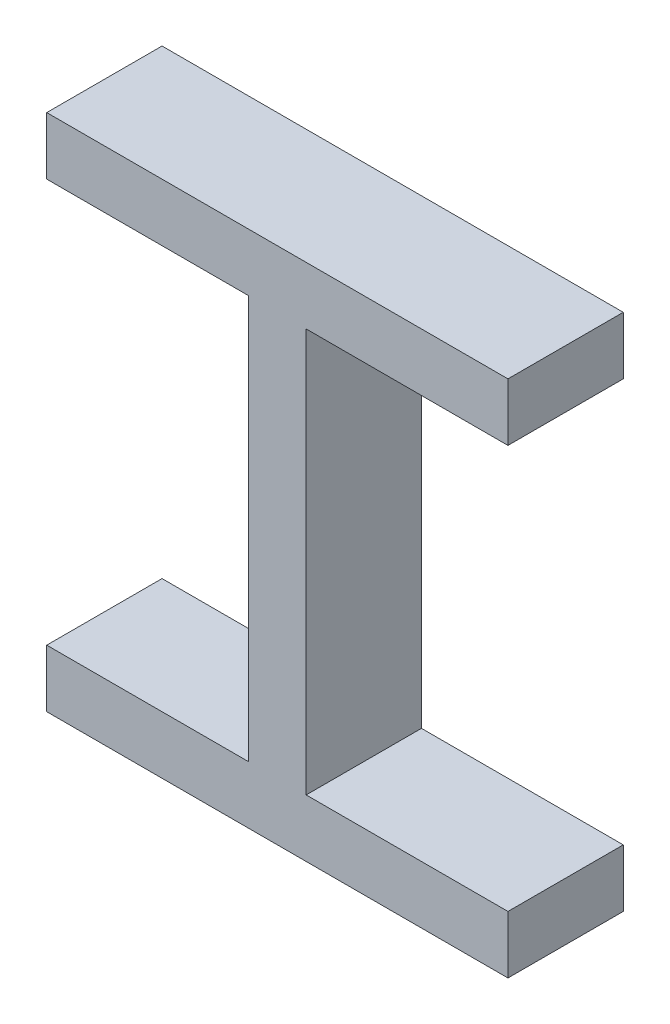
ISO-10303-21;
HEADER;
FILE_DESCRIPTION(('STEP AP214'),'2;1');
FILE_NAME('part.step','',(''),(''),'','','');
FILE_SCHEMA(('AUTOMOTIVE_DESIGN { 1 0 10303 214 1 1 1 1 }'));
ENDSEC;
DATA;
#1=APPLICATION_CONTEXT('core data for automotive mechanical design processes');
#2=APPLICATION_PROTOCOL_DEFINITION('international standard','automotive_design',2000,#1);
#3=PRODUCT_CONTEXT('',#1,'mechanical');
#4=PRODUCT('Part','Part','',(#3));
#5=PRODUCT_RELATED_PRODUCT_CATEGORY('part','',(#4));
#6=PRODUCT_DEFINITION_FORMATION('','',#4);
#7=PRODUCT_DEFINITION_CONTEXT('part definition',#1,'design');
#8=PRODUCT_DEFINITION('design','',#6,#7);
#9=PRODUCT_DEFINITION_SHAPE('','',#8);
#10=(LENGTH_UNIT() NAMED_UNIT(*) SI_UNIT(.MILLI.,.METRE.));
#11=(NAMED_UNIT(*) PLANE_ANGLE_UNIT() SI_UNIT($,.RADIAN.));
#12=(NAMED_UNIT(*) SI_UNIT($,.STERADIAN.) SOLID_ANGLE_UNIT());
#13=UNCERTAINTY_MEASURE_WITH_UNIT(LENGTH_MEASURE(1.E-05),#10,'distance_accuracy_value','');
#14=(GEOMETRIC_REPRESENTATION_CONTEXT(3) GLOBAL_UNCERTAINTY_ASSIGNED_CONTEXT((#13)) GLOBAL_UNIT_ASSIGNED_CONTEXT((#10,
#11,#12)) REPRESENTATION_CONTEXT('',''));
#15=CARTESIAN_POINT('',(0.,0.,0.));
#16=DIRECTION('',(0.,0.,1.));
#17=DIRECTION('',(1.,0.,0.));
#18=AXIS2_PLACEMENT_3D('',#15,#16,#17);
#19=CARTESIAN_POINT('',(0.,0.,40.));
#20=DIRECTION('',(1.,0.,0.));
#21=DIRECTION('',(0.,0.,-1.));
#22=AXIS2_PLACEMENT_3D('',#19,#20,#21);
#23=PLANE('',#22);
#24=DIRECTION('',(0.,-1.,0.));
#25=VECTOR('',#24,1.);
#26=CARTESIAN_POINT('',(0.,0.,0.));
#27=LINE('',#26,#25);
#28=CARTESIAN_POINT('',(0.,0.,0.));
#29=VERTEX_POINT('',#28);
#30=CARTESIAN_POINT('',(0.,-20.,0.));
#31=VERTEX_POINT('',#30);
#32=EDGE_CURVE('E169',#29,#31,#27,.T.);
#33=ORIENTED_EDGE('',*,*,#32,.T.);
#34=DIRECTION('',(0.,0.,-1.));
#35=VECTOR('',#34,1.);
#36=CARTESIAN_POINT('',(0.,-20.,40.));
#37=LINE('',#36,#35);
#38=CARTESIAN_POINT('',(0.,-20.,40.));
#39=VERTEX_POINT('',#38);
#40=EDGE_CURVE('E11',#39,#31,#37,.T.);
#41=ORIENTED_EDGE('',*,*,#40,.F.);
#42=DIRECTION('',(0.,-1.,0.));
#43=VECTOR('',#42,1.);
#44=CARTESIAN_POINT('',(0.,0.,40.));
#45=LINE('',#44,#43);
#46=CARTESIAN_POINT('',(0.,0.,40.));
#47=VERTEX_POINT('',#46);
#48=EDGE_CURVE('E203',#47,#39,#45,.T.);
#49=ORIENTED_EDGE('',*,*,#48,.F.);
#50=DIRECTION('',(0.,0.,-1.));
#51=VECTOR('',#50,1.);
#52=CARTESIAN_POINT('',(0.,0.,40.));
#53=LINE('',#52,#51);
#54=EDGE_CURVE('E165',#47,#29,#53,.T.);
#55=ORIENTED_EDGE('',*,*,#54,.T.);
#56=EDGE_LOOP('',(#33,#41,#49,#55));
#57=FACE_BOUND('',#56,.T.);
#58=ADVANCED_FACE('F44',(#57),#23,.F.);
#59=CARTESIAN_POINT('',(0.,-20.,40.));
#60=DIRECTION('',(0.,1.,0.));
#61=DIRECTION('',(0.,0.,1.));
#62=AXIS2_PLACEMENT_3D('',#59,#60,#61);
#63=PLANE('',#62);
#64=DIRECTION('',(1.,0.,0.));
#65=VECTOR('',#64,1.);
#66=CARTESIAN_POINT('',(0.,-20.,0.));
#67=LINE('',#66,#65);
#68=CARTESIAN_POINT('',(70.,-20.,0.));
#69=VERTEX_POINT('',#68);
#70=EDGE_CURVE('E173',#31,#69,#67,.T.);
#71=ORIENTED_EDGE('',*,*,#70,.T.);
#72=DIRECTION('',(0.,0.,-1.));
#73=VECTOR('',#72,1.);
#74=CARTESIAN_POINT('',(70.,-20.,40.));
#75=LINE('',#74,#73);
#76=CARTESIAN_POINT('',(70.,-20.,40.));
#77=VERTEX_POINT('',#76);
#78=EDGE_CURVE('E53',#77,#69,#75,.T.);
#79=ORIENTED_EDGE('',*,*,#78,.F.);
#80=DIRECTION('',(1.,0.,0.));
#81=VECTOR('',#80,1.);
#82=CARTESIAN_POINT('',(0.,-20.,40.));
#83=LINE('',#82,#81);
#84=EDGE_CURVE('E116',#39,#77,#83,.T.);
#85=ORIENTED_EDGE('',*,*,#84,.F.);
#86=ORIENTED_EDGE('',*,*,#40,.T.);
#87=EDGE_LOOP('',(#71,#79,#85,#86));
#88=FACE_BOUND('',#87,.T.);
#89=ADVANCED_FACE('F297',(#88),#63,.F.);
#90=CARTESIAN_POINT('',(70.,-20.,40.));
#91=DIRECTION('',(1.,0.,0.));
#92=DIRECTION('',(0.,1.,0.));
#93=AXIS2_PLACEMENT_3D('',#90,#91,#92);
#94=PLANE('',#93);
#95=DIRECTION('',(0.,-1.,0.));
#96=VECTOR('',#95,1.);
#97=CARTESIAN_POINT('',(70.,-20.,0.));
#98=LINE('',#97,#96);
#99=CARTESIAN_POINT('',(70.,-160.,0.));
#100=VERTEX_POINT('',#99);
#101=EDGE_CURVE('E176',#69,#100,#98,.T.);
#102=ORIENTED_EDGE('',*,*,#101,.T.);
#103=DIRECTION('',(0.,0.,-1.));
#104=VECTOR('',#103,1.);
#105=CARTESIAN_POINT('',(70.,-160.,40.));
#106=LINE('',#105,#104);
#107=CARTESIAN_POINT('',(70.,-160.,40.));
#108=VERTEX_POINT('',#107);
#109=EDGE_CURVE('E230',#108,#100,#106,.T.);
#110=ORIENTED_EDGE('',*,*,#109,.F.);
#111=DIRECTION('',(0.,-1.,0.));
#112=VECTOR('',#111,1.);
#113=CARTESIAN_POINT('',(70.,-20.,40.));
#114=LINE('',#113,#112);
#115=EDGE_CURVE('E240',#77,#108,#114,.T.);
#116=ORIENTED_EDGE('',*,*,#115,.F.);
#117=ORIENTED_EDGE('',*,*,#78,.T.);
#118=EDGE_LOOP('',(#102,#110,#116,#117));
#119=FACE_BOUND('',#118,.T.);
#120=ADVANCED_FACE('F238',(#119),#94,.F.);
#121=CARTESIAN_POINT('',(0.,-160.,40.));
#122=DIRECTION('',(0.,-1.,0.));
#123=DIRECTION('',(1.,0.,0.));
#124=AXIS2_PLACEMENT_3D('',#121,#122,#123);
#125=PLANE('',#124);
#126=DIRECTION('',(-1.,0.,0.));
#127=VECTOR('',#126,1.);
#128=CARTESIAN_POINT('',(0.,-160.,0.));
#129=LINE('',#128,#127);
#130=CARTESIAN_POINT('',(0.,-160.,0.));
#131=VERTEX_POINT('',#130);
#132=EDGE_CURVE('E179',#100,#131,#129,.T.);
#133=ORIENTED_EDGE('',*,*,#132,.T.);
#134=DIRECTION('',(0.,0.,-1.));
#135=VECTOR('',#134,1.);
#136=CARTESIAN_POINT('',(0.,-160.,40.));
#137=LINE('',#136,#135);
#138=CARTESIAN_POINT('',(0.,-160.,40.));
#139=VERTEX_POINT('',#138);
#140=EDGE_CURVE('E226',#139,#131,#137,.T.);
#141=ORIENTED_EDGE('',*,*,#140,.F.);
#142=DIRECTION('',(-1.,0.,0.));
#143=VECTOR('',#142,1.);
#144=CARTESIAN_POINT('',(0.,-160.,40.));
#145=LINE('',#144,#143);
#146=EDGE_CURVE('E259',#108,#139,#145,.T.);
#147=ORIENTED_EDGE('',*,*,#146,.F.);
#148=ORIENTED_EDGE('',*,*,#109,.T.);
#149=EDGE_LOOP('',(#133,#141,#147,#148));
#150=FACE_BOUND('',#149,.T.);
#151=ADVANCED_FACE('F249',(#150),#125,.F.);
#152=CARTESIAN_POINT('',(0.,-160.,40.));
#153=DIRECTION('',(1.,0.,0.));
#154=DIRECTION('',(0.,1.,0.));
#155=AXIS2_PLACEMENT_3D('',#152,#153,#154);
#156=PLANE('',#155);
#157=DIRECTION('',(0.,-1.,0.));
#158=VECTOR('',#157,1.);
#159=CARTESIAN_POINT('',(0.,-160.,0.));
#160=LINE('',#159,#158);
#161=CARTESIAN_POINT('',(0.,-180.,0.));
#162=VERTEX_POINT('',#161);
#163=EDGE_CURVE('E182',#131,#162,#160,.T.);
#164=ORIENTED_EDGE('',*,*,#163,.T.);
#165=DIRECTION('',(0.,0.,-1.));
#166=VECTOR('',#165,1.);
#167=CARTESIAN_POINT('',(0.,-180.,40.));
#168=LINE('',#167,#166);
#169=CARTESIAN_POINT('',(0.,-180.,40.));
#170=VERTEX_POINT('',#169);
#171=EDGE_CURVE('E222',#170,#162,#168,.T.);
#172=ORIENTED_EDGE('',*,*,#171,.F.);
#173=DIRECTION('',(0.,-1.,0.));
#174=VECTOR('',#173,1.);
#175=CARTESIAN_POINT('',(0.,-160.,40.));
#176=LINE('',#175,#174);
#177=EDGE_CURVE('E255',#139,#170,#176,.T.);
#178=ORIENTED_EDGE('',*,*,#177,.F.);
#179=ORIENTED_EDGE('',*,*,#140,.T.);
#180=EDGE_LOOP('',(#164,#172,#178,#179));
#181=FACE_BOUND('',#180,.T.);
#182=ADVANCED_FACE('F253',(#181),#156,.F.);
#183=CARTESIAN_POINT('',(0.,-180.,40.));
#184=DIRECTION('',(0.,1.,0.));
#185=DIRECTION('',(-1.,0.,0.));
#186=AXIS2_PLACEMENT_3D('',#183,#184,#185);
#187=PLANE('',#186);
#188=DIRECTION('',(1.,0.,0.));
#189=VECTOR('',#188,1.);
#190=CARTESIAN_POINT('',(0.,-180.,0.));
#191=LINE('',#190,#189);
#192=CARTESIAN_POINT('',(160.,-180.,0.));
#193=VERTEX_POINT('',#192);
#194=EDGE_CURVE('E185',#162,#193,#191,.T.);
#195=ORIENTED_EDGE('',*,*,#194,.T.);
#196=DIRECTION('',(0.,0.,-1.));
#197=VECTOR('',#196,1.);
#198=CARTESIAN_POINT('',(160.,-180.,40.));
#199=LINE('',#198,#197);
#200=CARTESIAN_POINT('',(160.,-180.,40.));
#201=VERTEX_POINT('',#200);
#202=EDGE_CURVE('E218',#201,#193,#199,.T.);
#203=ORIENTED_EDGE('',*,*,#202,.F.);
#204=DIRECTION('',(1.,0.,0.));
#205=VECTOR('',#204,1.);
#206=CARTESIAN_POINT('',(0.,-180.,40.));
#207=LINE('',#206,#205);
#208=EDGE_CURVE('E258',#170,#201,#207,.T.);
#209=ORIENTED_EDGE('',*,*,#208,.F.);
#210=ORIENTED_EDGE('',*,*,#171,.T.);
#211=EDGE_LOOP('',(#195,#203,#209,#210));
#212=FACE_BOUND('',#211,.T.);
#213=ADVANCED_FACE('F310',(#212),#187,.F.);
#214=CARTESIAN_POINT('',(160.,-160.,40.));
#215=DIRECTION('',(-1.,0.,0.));
#216=DIRECTION('',(0.,-1.,0.));
#217=AXIS2_PLACEMENT_3D('',#214,#215,#216);
#218=PLANE('',#217);
#219=DIRECTION('',(0.,1.,0.));
#220=VECTOR('',#219,1.);
#221=CARTESIAN_POINT('',(160.,-160.,0.));
#222=LINE('',#221,#220);
#223=CARTESIAN_POINT('',(160.,-160.,0.));
#224=VERTEX_POINT('',#223);
#225=EDGE_CURVE('E188',#193,#224,#222,.T.);
#226=ORIENTED_EDGE('',*,*,#225,.T.);
#227=DIRECTION('',(0.,0.,-1.));
#228=VECTOR('',#227,1.);
#229=CARTESIAN_POINT('',(160.,-160.,40.));
#230=LINE('',#229,#228);
#231=CARTESIAN_POINT('',(160.,-160.,40.));
#232=VERTEX_POINT('',#231);
#233=EDGE_CURVE('E214',#232,#224,#230,.T.);
#234=ORIENTED_EDGE('',*,*,#233,.F.);
#235=DIRECTION('',(0.,1.,0.));
#236=VECTOR('',#235,1.);
#237=CARTESIAN_POINT('',(160.,-160.,40.));
#238=LINE('',#237,#236);
#239=EDGE_CURVE('E263',#201,#232,#238,.T.);
#240=ORIENTED_EDGE('',*,*,#239,.F.);
#241=ORIENTED_EDGE('',*,*,#202,.T.);
#242=EDGE_LOOP('',(#226,#234,#240,#241));
#243=FACE_BOUND('',#242,.T.);
#244=ADVANCED_FACE('F313',(#243),#218,.F.);
#245=CARTESIAN_POINT('',(90.,-160.,40.));
#246=DIRECTION('',(0.,-1.,0.));
#247=DIRECTION('',(1.,0.,0.));
#248=AXIS2_PLACEMENT_3D('',#245,#246,#247);
#249=PLANE('',#248);
#250=DIRECTION('',(-1.,0.,0.));
#251=VECTOR('',#250,1.);
#252=CARTESIAN_POINT('',(90.,-160.,0.));
#253=LINE('',#252,#251);
#254=CARTESIAN_POINT('',(90.,-160.,0.));
#255=VERTEX_POINT('',#254);
#256=EDGE_CURVE('E191',#224,#255,#253,.T.);
#257=ORIENTED_EDGE('',*,*,#256,.T.);
#258=DIRECTION('',(0.,0.,-1.));
#259=VECTOR('',#258,1.);
#260=CARTESIAN_POINT('',(90.,-160.,40.));
#261=LINE('',#260,#259);
#262=CARTESIAN_POINT('',(90.,-160.,40.));
#263=VERTEX_POINT('',#262);
#264=EDGE_CURVE('E210',#263,#255,#261,.T.);
#265=ORIENTED_EDGE('',*,*,#264,.F.);
#266=DIRECTION('',(-1.,0.,0.));
#267=VECTOR('',#266,1.);
#268=CARTESIAN_POINT('',(90.,-160.,40.));
#269=LINE('',#268,#267);
#270=EDGE_CURVE('E270',#232,#263,#269,.T.);
#271=ORIENTED_EDGE('',*,*,#270,.F.);
#272=ORIENTED_EDGE('',*,*,#233,.T.);
#273=EDGE_LOOP('',(#257,#265,#271,#272));
#274=FACE_BOUND('',#273,.T.);
#275=ADVANCED_FACE('F278',(#274),#249,.F.);
#276=CARTESIAN_POINT('',(90.,-20.,40.));
#277=DIRECTION('',(-1.,0.,0.));
#278=DIRECTION('',(0.,-1.,0.));
#279=AXIS2_PLACEMENT_3D('',#276,#277,#278);
#280=PLANE('',#279);
#281=DIRECTION('',(0.,1.,0.));
#282=VECTOR('',#281,1.);
#283=CARTESIAN_POINT('',(90.,-20.,0.));
#284=LINE('',#283,#282);
#285=CARTESIAN_POINT('',(90.,-20.,0.));
#286=VERTEX_POINT('',#285);
#287=EDGE_CURVE('E194',#255,#286,#284,.T.);
#288=ORIENTED_EDGE('',*,*,#287,.T.);
#289=DIRECTION('',(0.,0.,-1.));
#290=VECTOR('',#289,1.);
#291=CARTESIAN_POINT('',(90.,-20.,40.));
#292=LINE('',#291,#290);
#293=CARTESIAN_POINT('',(90.,-20.,40.));
#294=VERTEX_POINT('',#293);
#295=EDGE_CURVE('E158',#294,#286,#292,.T.);
#296=ORIENTED_EDGE('',*,*,#295,.F.);
#297=DIRECTION('',(0.,1.,0.));
#298=VECTOR('',#297,1.);
#299=CARTESIAN_POINT('',(90.,-20.,40.));
#300=LINE('',#299,#298);
#301=EDGE_CURVE('E147',#263,#294,#300,.T.);
#302=ORIENTED_EDGE('',*,*,#301,.F.);
#303=ORIENTED_EDGE('',*,*,#264,.T.);
#304=EDGE_LOOP('',(#288,#296,#302,#303));
#305=FACE_BOUND('',#304,.T.);
#306=ADVANCED_FACE('F282',(#305),#280,.F.);
#307=CARTESIAN_POINT('',(90.,-20.,40.));
#308=DIRECTION('',(0.,1.,0.));
#309=DIRECTION('',(0.,0.,1.));
#310=AXIS2_PLACEMENT_3D('',#307,#308,#309);
#311=PLANE('',#310);
#312=DIRECTION('',(1.,0.,0.));
#313=VECTOR('',#312,1.);
#314=CARTESIAN_POINT('',(90.,-20.,0.));
#315=LINE('',#314,#313);
#316=CARTESIAN_POINT('',(160.,-20.,0.));
#317=VERTEX_POINT('',#316);
#318=EDGE_CURVE('E156',#286,#317,#315,.T.);
#319=ORIENTED_EDGE('',*,*,#318,.T.);
#320=DIRECTION('',(0.,0.,-1.));
#321=VECTOR('',#320,1.);
#322=CARTESIAN_POINT('',(160.,-20.,40.));
#323=LINE('',#322,#321);
#324=CARTESIAN_POINT('',(160.,-20.,40.));
#325=VERTEX_POINT('',#324);
#326=EDGE_CURVE('E153',#325,#317,#323,.T.);
#327=ORIENTED_EDGE('',*,*,#326,.F.);
#328=DIRECTION('',(1.,0.,0.));
#329=VECTOR('',#328,1.);
#330=CARTESIAN_POINT('',(90.,-20.,40.));
#331=LINE('',#330,#329);
#332=EDGE_CURVE('E141',#294,#325,#331,.T.);
#333=ORIENTED_EDGE('',*,*,#332,.F.);
#334=ORIENTED_EDGE('',*,*,#295,.T.);
#335=EDGE_LOOP('',(#319,#327,#333,#334));
#336=FACE_BOUND('',#335,.T.);
#337=ADVANCED_FACE('F154',(#336),#311,.F.);
#338=CARTESIAN_POINT('',(160.,0.,40.));
#339=DIRECTION('',(-1.,0.,0.));
#340=DIRECTION('',(0.,0.,1.));
#341=AXIS2_PLACEMENT_3D('',#338,#339,#340);
#342=PLANE('',#341);
#343=DIRECTION('',(0.,1.,0.));
#344=VECTOR('',#343,1.);
#345=CARTESIAN_POINT('',(160.,0.,0.));
#346=LINE('',#345,#344);
#347=CARTESIAN_POINT('',(160.,0.,0.));
#348=VERTEX_POINT('',#347);
#349=EDGE_CURVE('E102',#317,#348,#346,.T.);
#350=ORIENTED_EDGE('',*,*,#349,.T.);
#351=DIRECTION('',(0.,0.,-1.));
#352=VECTOR('',#351,1.);
#353=CARTESIAN_POINT('',(160.,0.,40.));
#354=LINE('',#353,#352);
#355=CARTESIAN_POINT('',(160.,0.,40.));
#356=VERTEX_POINT('',#355);
#357=EDGE_CURVE('E159',#356,#348,#354,.T.);
#358=ORIENTED_EDGE('',*,*,#357,.F.);
#359=DIRECTION('',(0.,1.,0.));
#360=VECTOR('',#359,1.);
#361=CARTESIAN_POINT('',(160.,0.,40.));
#362=LINE('',#361,#360);
#363=EDGE_CURVE('E145',#325,#356,#362,.T.);
#364=ORIENTED_EDGE('',*,*,#363,.F.);
#365=ORIENTED_EDGE('',*,*,#326,.T.);
#366=EDGE_LOOP('',(#350,#358,#364,#365));
#367=FACE_BOUND('',#366,.T.);
#368=ADVANCED_FACE('F161',(#367),#342,.F.);
#369=CARTESIAN_POINT('',(0.,0.,40.));
#370=DIRECTION('',(0.,-1.,0.));
#371=DIRECTION('',(0.,0.,-1.));
#372=AXIS2_PLACEMENT_3D('',#369,#370,#371);
#373=PLANE('',#372);
#374=DIRECTION('',(-1.,0.,0.));
#375=VECTOR('',#374,1.);
#376=CARTESIAN_POINT('',(0.,0.,0.));
#377=LINE('',#376,#375);
#378=EDGE_CURVE('E108',#348,#29,#377,.T.);
#379=ORIENTED_EDGE('',*,*,#378,.T.);
#380=ORIENTED_EDGE('',*,*,#54,.F.);
#381=DIRECTION('',(-1.,0.,0.));
#382=VECTOR('',#381,1.);
#383=CARTESIAN_POINT('',(0.,0.,40.));
#384=LINE('',#383,#382);
#385=EDGE_CURVE('E61',#356,#47,#384,.T.);
#386=ORIENTED_EDGE('',*,*,#385,.F.);
#387=ORIENTED_EDGE('',*,*,#357,.T.);
#388=EDGE_LOOP('',(#379,#380,#386,#387));
#389=FACE_BOUND('',#388,.T.);
#390=ADVANCED_FACE('F286',(#389),#373,.F.);
#391=CARTESIAN_POINT('',(0.,0.,40.));
#392=DIRECTION('',(0.,0.,1.));
#393=DIRECTION('',(1.,0.,0.));
#394=AXIS2_PLACEMENT_3D('',#391,#392,#393);
#395=PLANE('',#394);
#396=ORIENTED_EDGE('',*,*,#48,.T.);
#397=ORIENTED_EDGE('',*,*,#84,.T.);
#398=ORIENTED_EDGE('',*,*,#115,.T.);
#399=ORIENTED_EDGE('',*,*,#146,.T.);
#400=ORIENTED_EDGE('',*,*,#177,.T.);
#401=ORIENTED_EDGE('',*,*,#208,.T.);
#402=ORIENTED_EDGE('',*,*,#239,.T.);
#403=ORIENTED_EDGE('',*,*,#270,.T.);
#404=ORIENTED_EDGE('',*,*,#301,.T.);
#405=ORIENTED_EDGE('',*,*,#332,.T.);
#406=ORIENTED_EDGE('',*,*,#363,.T.);
#407=ORIENTED_EDGE('',*,*,#385,.T.);
#408=EDGE_LOOP('',(#396,#397,#398,#399,#400,#401,#402,#403,#404,#405,#406,#407));
#409=FACE_BOUND('',#408,.T.);
#410=ADVANCED_FACE('F143',(#409),#395,.T.);
#411=CARTESIAN_POINT('',(0.,0.,0.));
#412=DIRECTION('',(0.,0.,1.));
#413=DIRECTION('',(1.,0.,0.));
#414=AXIS2_PLACEMENT_3D('',#411,#412,#413);
#415=PLANE('',#414);
#416=ORIENTED_EDGE('',*,*,#32,.F.);
#417=ORIENTED_EDGE('',*,*,#378,.F.);
#418=ORIENTED_EDGE('',*,*,#349,.F.);
#419=ORIENTED_EDGE('',*,*,#318,.F.);
#420=ORIENTED_EDGE('',*,*,#287,.F.);
#421=ORIENTED_EDGE('',*,*,#256,.F.);
#422=ORIENTED_EDGE('',*,*,#225,.F.);
#423=ORIENTED_EDGE('',*,*,#194,.F.);
#424=ORIENTED_EDGE('',*,*,#163,.F.);
#425=ORIENTED_EDGE('',*,*,#132,.F.);
#426=ORIENTED_EDGE('',*,*,#101,.F.);
#427=ORIENTED_EDGE('',*,*,#70,.F.);
#428=EDGE_LOOP('',(#416,#417,#418,#419,#420,#421,#422,#423,#424,#425,#426,#427));
#429=FACE_BOUND('',#428,.T.);
#430=ADVANCED_FACE('F244',(#429),#415,.F.);
#431=CLOSED_SHELL('',(#58,#89,#120,#151,#182,#213,#244,#275,#306,#337,#368,#390,#410,#430));
#432=MANIFOLD_SOLID_BREP('B2',#431);
#433=ADVANCED_BREP_SHAPE_REPRESENTATION('',(#18,#432),#14);
#434=SHAPE_DEFINITION_REPRESENTATION(#9,#433);
ENDSEC;
END-ISO-10303-21;
